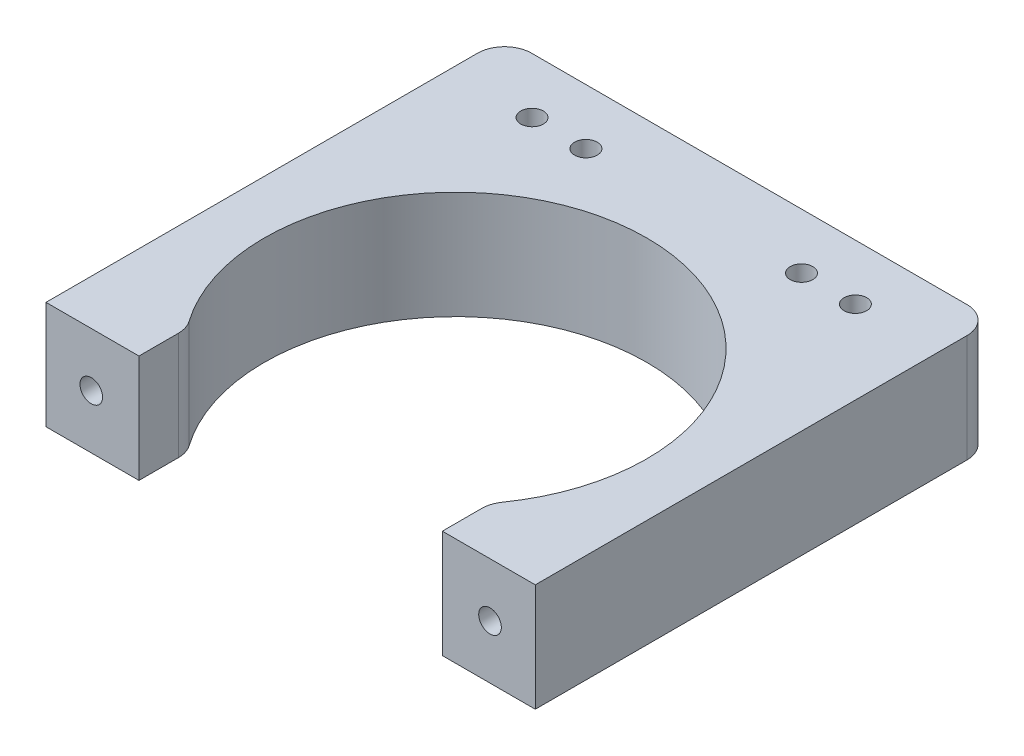
ISO-10303-21;
HEADER;
FILE_DESCRIPTION(('STEP AP214'),'2;1');
FILE_NAME('part.step','',(''),(''),'','','');
FILE_SCHEMA(('AUTOMOTIVE_DESIGN { 1 0 10303 214 1 1 1 1 }'));
ENDSEC;
DATA;
#1=APPLICATION_CONTEXT('core data for automotive mechanical design processes');
#2=APPLICATION_PROTOCOL_DEFINITION('international standard','automotive_design',2000,#1);
#3=PRODUCT_CONTEXT('',#1,'mechanical');
#4=PRODUCT('Part','Part','',(#3));
#5=PRODUCT_RELATED_PRODUCT_CATEGORY('part','',(#4));
#6=PRODUCT_DEFINITION_FORMATION('','',#4);
#7=PRODUCT_DEFINITION_CONTEXT('part definition',#1,'design');
#8=PRODUCT_DEFINITION('design','',#6,#7);
#9=PRODUCT_DEFINITION_SHAPE('','',#8);
#10=(LENGTH_UNIT() NAMED_UNIT(*) SI_UNIT(.MILLI.,.METRE.));
#11=(NAMED_UNIT(*) PLANE_ANGLE_UNIT() SI_UNIT($,.RADIAN.));
#12=(NAMED_UNIT(*) SI_UNIT($,.STERADIAN.) SOLID_ANGLE_UNIT());
#13=UNCERTAINTY_MEASURE_WITH_UNIT(LENGTH_MEASURE(1.E-05),#10,'distance_accuracy_value','');
#14=(GEOMETRIC_REPRESENTATION_CONTEXT(3) GLOBAL_UNCERTAINTY_ASSIGNED_CONTEXT((#13)) GLOBAL_UNIT_ASSIGNED_CONTEXT((#10,
#11,#12)) REPRESENTATION_CONTEXT('',''));
#15=CARTESIAN_POINT('',(0.,0.,0.));
#16=DIRECTION('',(0.,0.,1.));
#17=DIRECTION('',(1.,0.,0.));
#18=AXIS2_PLACEMENT_3D('',#15,#16,#17);
#19=CARTESIAN_POINT('',(45.4,20.,-42.55));
#20=DIRECTION('',(-1.,0.,0.));
#21=DIRECTION('',(0.,0.,1.));
#22=AXIS2_PLACEMENT_3D('',#19,#20,#21);
#23=PLANE('',#22);
#24=DIRECTION('',(0.,0.,-1.));
#25=VECTOR('',#24,1.);
#26=CARTESIAN_POINT('',(45.4,0.,-42.55));
#27=LINE('',#26,#25);
#28=CARTESIAN_POINT('',(45.4,0.,42.55));
#29=VERTEX_POINT('',#28);
#30=CARTESIAN_POINT('',(45.4,0.,-37.55));
#31=VERTEX_POINT('',#30);
#32=EDGE_CURVE('E216',#29,#31,#27,.T.);
#33=ORIENTED_EDGE('',*,*,#32,.T.);
#34=DIRECTION('',(0.,-1.,0.));
#35=VECTOR('',#34,1.);
#36=CARTESIAN_POINT('',(45.4,20.,-37.55));
#37=LINE('',#36,#35);
#38=CARTESIAN_POINT('',(45.4,20.,-37.55));
#39=VERTEX_POINT('',#38);
#40=EDGE_CURVE('E49',#31,#39,#37,.F.);
#41=ORIENTED_EDGE('',*,*,#40,.T.);
#42=DIRECTION('',(0.,0.,-1.));
#43=VECTOR('',#42,1.);
#44=CARTESIAN_POINT('',(45.4,20.,-42.55));
#45=LINE('',#44,#43);
#46=CARTESIAN_POINT('',(45.4,20.,42.55));
#47=VERTEX_POINT('',#46);
#48=EDGE_CURVE('E237',#47,#39,#45,.T.);
#49=ORIENTED_EDGE('',*,*,#48,.F.);
#50=DIRECTION('',(0.,-1.,0.));
#51=VECTOR('',#50,1.);
#52=CARTESIAN_POINT('',(45.4,20.,42.55));
#53=LINE('',#52,#51);
#54=EDGE_CURVE('E256',#47,#29,#53,.T.);
#55=ORIENTED_EDGE('',*,*,#54,.T.);
#56=EDGE_LOOP('',(#33,#41,#49,#55));
#57=FACE_BOUND('',#56,.T.);
#58=ADVANCED_FACE('F41',(#57),#23,.F.);
#59=CARTESIAN_POINT('',(-45.4,20.,-42.55));
#60=DIRECTION('',(0.,0.,1.));
#61=DIRECTION('',(1.,0.,0.));
#62=AXIS2_PLACEMENT_3D('',#59,#60,#61);
#63=PLANE('',#62);
#64=CARTESIAN_POINT('',(30.,10.,-42.55));
#65=DIRECTION('',(0.,0.,-1.));
#66=DIRECTION('',(-1.,0.,0.));
#67=AXIS2_PLACEMENT_3D('',#64,#65,#66);
#68=CIRCLE('',#67,2.09999999999999);
#69=CARTESIAN_POINT('',(27.9,10.,-42.55));
#70=VERTEX_POINT('',#69);
#71=EDGE_CURVE('E188',#70,#70,#68,.T.);
#72=ORIENTED_EDGE('',*,*,#71,.F.);
#73=EDGE_LOOP('',(#72));
#74=FACE_BOUND('',#73,.T.);
#75=CARTESIAN_POINT('',(10.,10.,-42.55));
#76=DIRECTION('',(0.,0.,-1.));
#77=DIRECTION('',(-1.,0.,0.));
#78=AXIS2_PLACEMENT_3D('',#75,#76,#77);
#79=CIRCLE('',#78,2.09999999999999);
#80=CARTESIAN_POINT('',(7.90000000000001,10.,-42.55));
#81=VERTEX_POINT('',#80);
#82=EDGE_CURVE('E194',#81,#81,#79,.T.);
#83=ORIENTED_EDGE('',*,*,#82,.F.);
#84=EDGE_LOOP('',(#83));
#85=FACE_BOUND('',#84,.T.);
#86=CARTESIAN_POINT('',(-10.,10.,-42.55));
#87=DIRECTION('',(0.,0.,-1.));
#88=DIRECTION('',(-1.,0.,0.));
#89=AXIS2_PLACEMENT_3D('',#86,#87,#88);
#90=CIRCLE('',#89,2.09999999999999);
#91=CARTESIAN_POINT('',(-12.1,10.,-42.55));
#92=VERTEX_POINT('',#91);
#93=EDGE_CURVE('E200',#92,#92,#90,.T.);
#94=ORIENTED_EDGE('',*,*,#93,.F.);
#95=EDGE_LOOP('',(#94));
#96=FACE_BOUND('',#95,.T.);
#97=CARTESIAN_POINT('',(-30.,10.,-42.55));
#98=DIRECTION('',(0.,0.,-1.));
#99=DIRECTION('',(-1.,0.,0.));
#100=AXIS2_PLACEMENT_3D('',#97,#98,#99);
#101=CIRCLE('',#100,2.09999999999999);
#102=CARTESIAN_POINT('',(-32.1,10.,-42.55));
#103=VERTEX_POINT('',#102);
#104=EDGE_CURVE('E206',#103,#103,#101,.T.);
#105=ORIENTED_EDGE('',*,*,#104,.F.);
#106=EDGE_LOOP('',(#105));
#107=FACE_BOUND('',#106,.T.);
#108=DIRECTION('',(-1.,0.,0.));
#109=VECTOR('',#108,1.);
#110=CARTESIAN_POINT('',(-45.4,20.,-42.55));
#111=LINE('',#110,#109);
#112=CARTESIAN_POINT('',(40.4,20.,-42.55));
#113=VERTEX_POINT('',#112);
#114=CARTESIAN_POINT('',(-40.4,20.,-42.55));
#115=VERTEX_POINT('',#114);
#116=EDGE_CURVE('E240',#113,#115,#111,.T.);
#117=ORIENTED_EDGE('',*,*,#116,.F.);
#118=DIRECTION('',(0.,-1.,0.));
#119=VECTOR('',#118,1.);
#120=CARTESIAN_POINT('',(40.4,20.,-42.55));
#121=LINE('',#120,#119);
#122=CARTESIAN_POINT('',(40.4,0.,-42.55));
#123=VERTEX_POINT('',#122);
#124=EDGE_CURVE('E311',#113,#123,#121,.T.);
#125=ORIENTED_EDGE('',*,*,#124,.T.);
#126=DIRECTION('',(-1.,0.,0.));
#127=VECTOR('',#126,1.);
#128=CARTESIAN_POINT('',(-45.4,0.,-42.55));
#129=LINE('',#128,#127);
#130=CARTESIAN_POINT('',(-40.4,0.,-42.55));
#131=VERTEX_POINT('',#130);
#132=EDGE_CURVE('E259',#123,#131,#129,.T.);
#133=ORIENTED_EDGE('',*,*,#132,.T.);
#134=DIRECTION('',(0.,-1.,0.));
#135=VECTOR('',#134,1.);
#136=CARTESIAN_POINT('',(-40.4,20.,-42.55));
#137=LINE('',#136,#135);
#138=EDGE_CURVE('E309',#131,#115,#137,.F.);
#139=ORIENTED_EDGE('',*,*,#138,.T.);
#140=EDGE_LOOP('',(#117,#125,#133,#139));
#141=FACE_BOUND('',#140,.T.);
#142=ADVANCED_FACE('F327',(#74,#85,#96,#107,#141),#63,.F.);
#143=CARTESIAN_POINT('',(-45.4,20.,-42.55));
#144=DIRECTION('',(1.,0.,0.));
#145=DIRECTION('',(0.,0.,-1.));
#146=AXIS2_PLACEMENT_3D('',#143,#144,#145);
#147=PLANE('',#146);
#148=CARTESIAN_POINT('',(-45.4,10.,-17.45));
#149=DIRECTION('',(-1.,0.,0.));
#150=DIRECTION('',(0.,0.,1.));
#151=AXIS2_PLACEMENT_3D('',#148,#149,#150);
#152=CIRCLE('',#151,2.09999999999999);
#153=CARTESIAN_POINT('',(-45.4,10.,-15.35));
#154=VERTEX_POINT('',#153);
#155=EDGE_CURVE('E176',#154,#154,#152,.T.);
#156=ORIENTED_EDGE('',*,*,#155,.F.);
#157=EDGE_LOOP('',(#156));
#158=FACE_BOUND('',#157,.T.);
#159=CARTESIAN_POINT('',(-45.4,10.,22.55));
#160=DIRECTION('',(-1.,0.,0.));
#161=DIRECTION('',(0.,0.,1.));
#162=AXIS2_PLACEMENT_3D('',#159,#160,#161);
#163=CIRCLE('',#162,2.09999999999999);
#164=CARTESIAN_POINT('',(-45.4,10.,24.65));
#165=VERTEX_POINT('',#164);
#166=EDGE_CURVE('E182',#165,#165,#163,.T.);
#167=ORIENTED_EDGE('',*,*,#166,.F.);
#168=EDGE_LOOP('',(#167));
#169=FACE_BOUND('',#168,.T.);
#170=DIRECTION('',(0.,0.,1.));
#171=VECTOR('',#170,1.);
#172=CARTESIAN_POINT('',(-45.4,20.,-42.55));
#173=LINE('',#172,#171);
#174=CARTESIAN_POINT('',(-45.4,20.,-37.55));
#175=VERTEX_POINT('',#174);
#176=CARTESIAN_POINT('',(-45.4,20.,42.55));
#177=VERTEX_POINT('',#176);
#178=EDGE_CURVE('E243',#175,#177,#173,.T.);
#179=ORIENTED_EDGE('',*,*,#178,.F.);
#180=DIRECTION('',(0.,-1.,0.));
#181=VECTOR('',#180,1.);
#182=CARTESIAN_POINT('',(-45.4,20.,-37.55));
#183=LINE('',#182,#181);
#184=CARTESIAN_POINT('',(-45.4,0.,-37.55));
#185=VERTEX_POINT('',#184);
#186=EDGE_CURVE('E12',#175,#185,#183,.T.);
#187=ORIENTED_EDGE('',*,*,#186,.T.);
#188=DIRECTION('',(0.,0.,1.));
#189=VECTOR('',#188,1.);
#190=CARTESIAN_POINT('',(-45.4,0.,-42.55));
#191=LINE('',#190,#189);
#192=CARTESIAN_POINT('',(-45.4,0.,42.55));
#193=VERTEX_POINT('',#192);
#194=EDGE_CURVE('E262',#185,#193,#191,.T.);
#195=ORIENTED_EDGE('',*,*,#194,.T.);
#196=DIRECTION('',(0.,-1.,0.));
#197=VECTOR('',#196,1.);
#198=CARTESIAN_POINT('',(-45.4,20.,42.55));
#199=LINE('',#198,#197);
#200=EDGE_CURVE('E282',#177,#193,#199,.T.);
#201=ORIENTED_EDGE('',*,*,#200,.F.);
#202=EDGE_LOOP('',(#179,#187,#195,#201));
#203=FACE_BOUND('',#202,.T.);
#204=ADVANCED_FACE('F337',(#158,#169,#203),#147,.F.);
#205=CARTESIAN_POINT('',(-45.4,20.,42.55));
#206=DIRECTION('',(0.,0.,-1.));
#207=DIRECTION('',(-1.,0.,0.));
#208=AXIS2_PLACEMENT_3D('',#205,#206,#207);
#209=PLANE('',#208);
#210=CARTESIAN_POINT('',(-37.,10.,42.55));
#211=DIRECTION('',(0.,0.,1.));
#212=DIRECTION('',(1.,0.,0.));
#213=AXIS2_PLACEMENT_3D('',#210,#211,#212);
#214=CIRCLE('',#213,2.09999999999999);
#215=CARTESIAN_POINT('',(-34.9,10.,42.55));
#216=VERTEX_POINT('',#215);
#217=EDGE_CURVE('E165',#216,#216,#214,.T.);
#218=ORIENTED_EDGE('',*,*,#217,.F.);
#219=EDGE_LOOP('',(#218));
#220=FACE_BOUND('',#219,.T.);
#221=DIRECTION('',(1.,0.,0.));
#222=VECTOR('',#221,1.);
#223=CARTESIAN_POINT('',(-45.4,0.,42.55));
#224=LINE('',#223,#222);
#225=CARTESIAN_POINT('',(-28.15,0.,42.55));
#226=VERTEX_POINT('',#225);
#227=EDGE_CURVE('E264',#193,#226,#224,.T.);
#228=ORIENTED_EDGE('',*,*,#227,.T.);
#229=DIRECTION('',(0.,-1.,0.));
#230=VECTOR('',#229,1.);
#231=CARTESIAN_POINT('',(-28.15,20.,42.55));
#232=LINE('',#231,#230);
#233=CARTESIAN_POINT('',(-28.15,20.,42.55));
#234=VERTEX_POINT('',#233);
#235=EDGE_CURVE('E279',#234,#226,#232,.T.);
#236=ORIENTED_EDGE('',*,*,#235,.F.);
#237=DIRECTION('',(1.,0.,0.));
#238=VECTOR('',#237,1.);
#239=CARTESIAN_POINT('',(-45.4,20.,42.55));
#240=LINE('',#239,#238);
#241=EDGE_CURVE('E245',#177,#234,#240,.T.);
#242=ORIENTED_EDGE('',*,*,#241,.F.);
#243=ORIENTED_EDGE('',*,*,#200,.T.);
#244=EDGE_LOOP('',(#228,#236,#242,#243));
#245=FACE_BOUND('',#244,.T.);
#246=ADVANCED_FACE('F343',(#220,#245),#209,.F.);
#247=CARTESIAN_POINT('',(-28.15,20.,42.55));
#248=DIRECTION('',(-1.,0.,0.));
#249=DIRECTION('',(0.,0.,1.));
#250=AXIS2_PLACEMENT_3D('',#247,#248,#249);
#251=PLANE('',#250);
#252=DIRECTION('',(0.,0.,-1.));
#253=VECTOR('',#252,1.);
#254=CARTESIAN_POINT('',(-28.15,0.,42.55));
#255=LINE('',#254,#253);
#256=CARTESIAN_POINT('',(-28.15,0.,35.2164457964684));
#257=VERTEX_POINT('',#256);
#258=EDGE_CURVE('E266',#226,#257,#255,.T.);
#259=ORIENTED_EDGE('',*,*,#258,.T.);
#260=DIRECTION('',(0.,-1.,0.));
#261=VECTOR('',#260,1.);
#262=CARTESIAN_POINT('',(-28.15,20.,35.2164457964684));
#263=LINE('',#262,#261);
#264=CARTESIAN_POINT('',(-28.15,20.,35.2164457964684));
#265=VERTEX_POINT('',#264);
#266=EDGE_CURVE('E56',#257,#265,#263,.F.);
#267=ORIENTED_EDGE('',*,*,#266,.T.);
#268=DIRECTION('',(0.,0.,-1.));
#269=VECTOR('',#268,1.);
#270=CARTESIAN_POINT('',(-28.15,20.,42.55));
#271=LINE('',#270,#269);
#272=EDGE_CURVE('E247',#234,#265,#271,.T.);
#273=ORIENTED_EDGE('',*,*,#272,.F.);
#274=ORIENTED_EDGE('',*,*,#235,.T.);
#275=EDGE_LOOP('',(#259,#267,#273,#274));
#276=FACE_BOUND('',#275,.T.);
#277=ADVANCED_FACE('F345',(#276),#251,.F.);
#278=CARTESIAN_POINT('',(0.,20.,11.95));
#279=DIRECTION('',(0.,-1.,0.));
#280=DIRECTION('',(0.,0.,-1.));
#281=AXIS2_PLACEMENT_3D('',#278,#279,#280);
#282=CYLINDRICAL_SURFACE('',#281,35.5);
#283=CARTESIAN_POINT('',(0.,0.,11.95));
#284=DIRECTION('',(0.,-1.,0.));
#285=DIRECTION('',(0.,0.,1.));
#286=AXIS2_PLACEMENT_3D('',#283,#284,#285);
#287=CIRCLE('',#286,35.5);
#288=CARTESIAN_POINT('',(-29.0574074074074,0.,32.344045080855));
#289=VERTEX_POINT('',#288);
#290=CARTESIAN_POINT('',(29.0574074074074,0.,32.344045080855));
#291=VERTEX_POINT('',#290);
#292=EDGE_CURVE('E268',#289,#291,#287,.T.);
#293=ORIENTED_EDGE('',*,*,#292,.T.);
#294=DIRECTION('',(0.,-1.,0.));
#295=VECTOR('',#294,1.);
#296=CARTESIAN_POINT('',(29.0574074074074,20.,32.344045080855));
#297=LINE('',#296,#295);
#298=CARTESIAN_POINT('',(29.0574074074074,20.,32.344045080855));
#299=VERTEX_POINT('',#298);
#300=EDGE_CURVE('E299',#291,#299,#297,.F.);
#301=ORIENTED_EDGE('',*,*,#300,.T.);
#302=CARTESIAN_POINT('',(0.,20.,11.95));
#303=DIRECTION('',(0.,-1.,0.));
#304=DIRECTION('',(0.,0.,1.));
#305=AXIS2_PLACEMENT_3D('',#302,#303,#304);
#306=CIRCLE('',#305,35.5);
#307=CARTESIAN_POINT('',(-29.0574074074074,20.,32.344045080855));
#308=VERTEX_POINT('',#307);
#309=EDGE_CURVE('E249',#308,#299,#306,.T.);
#310=ORIENTED_EDGE('',*,*,#309,.F.);
#311=DIRECTION('',(0.,-1.,0.));
#312=VECTOR('',#311,1.);
#313=CARTESIAN_POINT('',(-29.0574074074074,20.,32.344045080855));
#314=LINE('',#313,#312);
#315=EDGE_CURVE('E296',#308,#289,#314,.T.);
#316=ORIENTED_EDGE('',*,*,#315,.T.);
#317=EDGE_LOOP('',(#293,#301,#310,#316));
#318=FACE_BOUND('',#317,.T.);
#319=ADVANCED_FACE('F347',(#318),#282,.F.);
#320=CARTESIAN_POINT('',(28.15,20.,42.55));
#321=DIRECTION('',(1.,0.,0.));
#322=DIRECTION('',(0.,0.,-1.));
#323=AXIS2_PLACEMENT_3D('',#320,#321,#322);
#324=PLANE('',#323);
#325=DIRECTION('',(0.,0.,1.));
#326=VECTOR('',#325,1.);
#327=CARTESIAN_POINT('',(28.15,20.,42.55));
#328=LINE('',#327,#326);
#329=CARTESIAN_POINT('',(28.15,20.,35.2164457964684));
#330=VERTEX_POINT('',#329);
#331=CARTESIAN_POINT('',(28.15,20.,42.55));
#332=VERTEX_POINT('',#331);
#333=EDGE_CURVE('E252',#330,#332,#328,.T.);
#334=ORIENTED_EDGE('',*,*,#333,.F.);
#335=DIRECTION('',(0.,-1.,0.));
#336=VECTOR('',#335,1.);
#337=CARTESIAN_POINT('',(28.15,20.,35.2164457964684));
#338=LINE('',#337,#336);
#339=CARTESIAN_POINT('',(28.15,0.,35.2164457964684));
#340=VERTEX_POINT('',#339);
#341=EDGE_CURVE('E285',#330,#340,#338,.T.);
#342=ORIENTED_EDGE('',*,*,#341,.T.);
#343=DIRECTION('',(0.,0.,1.));
#344=VECTOR('',#343,1.);
#345=CARTESIAN_POINT('',(28.15,0.,42.55));
#346=LINE('',#345,#344);
#347=CARTESIAN_POINT('',(28.15,0.,42.55));
#348=VERTEX_POINT('',#347);
#349=EDGE_CURVE('E271',#340,#348,#346,.T.);
#350=ORIENTED_EDGE('',*,*,#349,.T.);
#351=DIRECTION('',(0.,-1.,0.));
#352=VECTOR('',#351,1.);
#353=CARTESIAN_POINT('',(28.15,20.,42.55));
#354=LINE('',#353,#352);
#355=EDGE_CURVE('E276',#332,#348,#354,.T.);
#356=ORIENTED_EDGE('',*,*,#355,.F.);
#357=EDGE_LOOP('',(#334,#342,#350,#356));
#358=FACE_BOUND('',#357,.T.);
#359=ADVANCED_FACE('F353',(#358),#324,.F.);
#360=CARTESIAN_POINT('',(28.15,20.,42.55));
#361=DIRECTION('',(0.,0.,-1.));
#362=DIRECTION('',(-1.,0.,0.));
#363=AXIS2_PLACEMENT_3D('',#360,#361,#362);
#364=PLANE('',#363);
#365=CARTESIAN_POINT('',(37.,10.,42.55));
#366=DIRECTION('',(0.,0.,1.));
#367=DIRECTION('',(1.,0.,0.));
#368=AXIS2_PLACEMENT_3D('',#365,#366,#367);
#369=CIRCLE('',#368,2.09999999999999);
#370=CARTESIAN_POINT('',(39.1,10.,42.55));
#371=VERTEX_POINT('',#370);
#372=EDGE_CURVE('E166',#371,#371,#369,.T.);
#373=ORIENTED_EDGE('',*,*,#372,.F.);
#374=EDGE_LOOP('',(#373));
#375=FACE_BOUND('',#374,.T.);
#376=DIRECTION('',(1.,0.,0.));
#377=VECTOR('',#376,1.);
#378=CARTESIAN_POINT('',(28.15,0.,42.55));
#379=LINE('',#378,#377);
#380=EDGE_CURVE('E241',#348,#29,#379,.T.);
#381=ORIENTED_EDGE('',*,*,#380,.T.);
#382=ORIENTED_EDGE('',*,*,#54,.F.);
#383=DIRECTION('',(1.,0.,0.));
#384=VECTOR('',#383,1.);
#385=CARTESIAN_POINT('',(28.15,20.,42.55));
#386=LINE('',#385,#384);
#387=EDGE_CURVE('E254',#332,#47,#386,.T.);
#388=ORIENTED_EDGE('',*,*,#387,.F.);
#389=ORIENTED_EDGE('',*,*,#355,.T.);
#390=EDGE_LOOP('',(#381,#382,#388,#389));
#391=FACE_BOUND('',#390,.T.);
#392=ADVANCED_FACE('F610',(#375,#391),#364,.F.);
#393=CARTESIAN_POINT('',(0.,20.,11.95));
#394=DIRECTION('',(0.,1.,0.));
#395=DIRECTION('',(0.,0.,1.));
#396=AXIS2_PLACEMENT_3D('',#393,#394,#395);
#397=PLANE('',#396);
#398=CARTESIAN_POINT('',(-30.,20.,-32.25));
#399=DIRECTION('',(0.,1.,0.));
#400=DIRECTION('',(0.,0.,1.));
#401=AXIS2_PLACEMENT_3D('',#398,#399,#400);
#402=CIRCLE('',#401,2.1);
#403=CARTESIAN_POINT('',(-30.,20.,-30.15));
#404=VERTEX_POINT('',#403);
#405=EDGE_CURVE('E217',#404,#404,#402,.T.);
#406=ORIENTED_EDGE('',*,*,#405,.F.);
#407=EDGE_LOOP('',(#406));
#408=FACE_BOUND('',#407,.T.);
#409=CARTESIAN_POINT('',(-20.,20.,-32.25));
#410=DIRECTION('',(0.,1.,0.));
#411=DIRECTION('',(0.,0.,1.));
#412=AXIS2_PLACEMENT_3D('',#409,#410,#411);
#413=CIRCLE('',#412,2.1);
#414=CARTESIAN_POINT('',(-20.,20.,-30.15));
#415=VERTEX_POINT('',#414);
#416=EDGE_CURVE('E220',#415,#415,#413,.T.);
#417=ORIENTED_EDGE('',*,*,#416,.F.);
#418=EDGE_LOOP('',(#417));
#419=FACE_BOUND('',#418,.T.);
#420=CARTESIAN_POINT('',(20.,20.,-32.25));
#421=DIRECTION('',(0.,1.,0.));
#422=DIRECTION('',(0.,0.,-1.));
#423=AXIS2_PLACEMENT_3D('',#420,#421,#422);
#424=CIRCLE('',#423,2.1);
#425=CARTESIAN_POINT('',(20.,20.,-34.35));
#426=VERTEX_POINT('',#425);
#427=EDGE_CURVE('E226',#426,#426,#424,.T.);
#428=ORIENTED_EDGE('',*,*,#427,.F.);
#429=EDGE_LOOP('',(#428));
#430=FACE_BOUND('',#429,.T.);
#431=CARTESIAN_POINT('',(30.,20.,-32.25));
#432=DIRECTION('',(0.,1.,0.));
#433=DIRECTION('',(0.,0.,-1.));
#434=AXIS2_PLACEMENT_3D('',#431,#432,#433);
#435=CIRCLE('',#434,2.1);
#436=CARTESIAN_POINT('',(30.,20.,-34.35));
#437=VERTEX_POINT('',#436);
#438=EDGE_CURVE('E232',#437,#437,#435,.T.);
#439=ORIENTED_EDGE('',*,*,#438,.F.);
#440=EDGE_LOOP('',(#439));
#441=FACE_BOUND('',#440,.T.);
#442=ORIENTED_EDGE('',*,*,#309,.T.);
#443=CARTESIAN_POINT('',(33.15,20.,35.2164457964684));
#444=DIRECTION('',(0.,1.,0.));
#445=DIRECTION('',(0.,0.,1.));
#446=AXIS2_PLACEMENT_3D('',#443,#444,#445);
#447=CIRCLE('',#446,5.);
#448=EDGE_CURVE('E306',#299,#330,#447,.T.);
#449=ORIENTED_EDGE('',*,*,#448,.T.);
#450=ORIENTED_EDGE('',*,*,#333,.T.);
#451=ORIENTED_EDGE('',*,*,#387,.T.);
#452=ORIENTED_EDGE('',*,*,#48,.T.);
#453=CARTESIAN_POINT('',(40.4,20.,-37.55));
#454=DIRECTION('',(0.,1.,0.));
#455=DIRECTION('',(0.,0.,1.));
#456=AXIS2_PLACEMENT_3D('',#453,#454,#455);
#457=CIRCLE('',#456,5.);
#458=EDGE_CURVE('E302',#39,#113,#457,.T.);
#459=ORIENTED_EDGE('',*,*,#458,.T.);
#460=ORIENTED_EDGE('',*,*,#116,.T.);
#461=CARTESIAN_POINT('',(-40.4,20.,-37.55));
#462=DIRECTION('',(0.,1.,0.));
#463=DIRECTION('',(0.,0.,1.));
#464=AXIS2_PLACEMENT_3D('',#461,#462,#463);
#465=CIRCLE('',#464,5.);
#466=EDGE_CURVE('E64',#115,#175,#465,.T.);
#467=ORIENTED_EDGE('',*,*,#466,.T.);
#468=ORIENTED_EDGE('',*,*,#178,.T.);
#469=ORIENTED_EDGE('',*,*,#241,.T.);
#470=ORIENTED_EDGE('',*,*,#272,.T.);
#471=CARTESIAN_POINT('',(-33.15,20.,35.2164457964684));
#472=DIRECTION('',(0.,1.,0.));
#473=DIRECTION('',(0.,0.,1.));
#474=AXIS2_PLACEMENT_3D('',#471,#472,#473);
#475=CIRCLE('',#474,5.);
#476=EDGE_CURVE('E304',#265,#308,#475,.T.);
#477=ORIENTED_EDGE('',*,*,#476,.T.);
#478=EDGE_LOOP('',(#442,#449,#450,#451,#452,#459,#460,#467,#468,#469,#470,#477));
#479=FACE_BOUND('',#478,.T.);
#480=ADVANCED_FACE('F319',(#408,#419,#430,#441,#479),#397,.T.);
#481=CARTESIAN_POINT('',(0.,0.,11.95));
#482=DIRECTION('',(0.,1.,0.));
#483=DIRECTION('',(0.,0.,1.));
#484=AXIS2_PLACEMENT_3D('',#481,#482,#483);
#485=PLANE('',#484);
#486=CARTESIAN_POINT('',(-30.,0.,-32.25));
#487=DIRECTION('',(0.,1.,0.));
#488=DIRECTION('',(0.,0.,1.));
#489=AXIS2_PLACEMENT_3D('',#486,#487,#488);
#490=CIRCLE('',#489,2.1);
#491=CARTESIAN_POINT('',(-30.,0.,-30.15));
#492=VERTEX_POINT('',#491);
#493=EDGE_CURVE('E213',#492,#492,#490,.T.);
#494=ORIENTED_EDGE('',*,*,#493,.T.);
#495=EDGE_LOOP('',(#494));
#496=FACE_BOUND('',#495,.T.);
#497=CARTESIAN_POINT('',(-20.,0.,-32.25));
#498=DIRECTION('',(0.,1.,0.));
#499=DIRECTION('',(0.,0.,1.));
#500=AXIS2_PLACEMENT_3D('',#497,#498,#499);
#501=CIRCLE('',#500,2.1);
#502=CARTESIAN_POINT('',(-20.,0.,-30.15));
#503=VERTEX_POINT('',#502);
#504=EDGE_CURVE('E223',#503,#503,#501,.T.);
#505=ORIENTED_EDGE('',*,*,#504,.T.);
#506=EDGE_LOOP('',(#505));
#507=FACE_BOUND('',#506,.T.);
#508=CARTESIAN_POINT('',(20.,0.,-32.25));
#509=DIRECTION('',(0.,1.,0.));
#510=DIRECTION('',(0.,0.,-1.));
#511=AXIS2_PLACEMENT_3D('',#508,#509,#510);
#512=CIRCLE('',#511,2.1);
#513=CARTESIAN_POINT('',(20.,0.,-34.35));
#514=VERTEX_POINT('',#513);
#515=EDGE_CURVE('E229',#514,#514,#512,.T.);
#516=ORIENTED_EDGE('',*,*,#515,.T.);
#517=EDGE_LOOP('',(#516));
#518=FACE_BOUND('',#517,.T.);
#519=CARTESIAN_POINT('',(30.,0.,-32.25));
#520=DIRECTION('',(0.,1.,0.));
#521=DIRECTION('',(0.,0.,-1.));
#522=AXIS2_PLACEMENT_3D('',#519,#520,#521);
#523=CIRCLE('',#522,2.1);
#524=CARTESIAN_POINT('',(30.,0.,-34.35));
#525=VERTEX_POINT('',#524);
#526=EDGE_CURVE('E212',#525,#525,#523,.T.);
#527=ORIENTED_EDGE('',*,*,#526,.T.);
#528=EDGE_LOOP('',(#527));
#529=FACE_BOUND('',#528,.T.);
#530=ORIENTED_EDGE('',*,*,#349,.F.);
#531=CARTESIAN_POINT('',(33.15,0.,35.2164457964684));
#532=DIRECTION('',(0.,1.,0.));
#533=DIRECTION('',(0.,0.,1.));
#534=AXIS2_PLACEMENT_3D('',#531,#532,#533);
#535=CIRCLE('',#534,5.);
#536=EDGE_CURVE('E294',#340,#291,#535,.F.);
#537=ORIENTED_EDGE('',*,*,#536,.T.);
#538=ORIENTED_EDGE('',*,*,#292,.F.);
#539=CARTESIAN_POINT('',(-33.15,0.,35.2164457964684));
#540=DIRECTION('',(0.,1.,0.));
#541=DIRECTION('',(0.,0.,1.));
#542=AXIS2_PLACEMENT_3D('',#539,#540,#541);
#543=CIRCLE('',#542,5.);
#544=EDGE_CURVE('E292',#289,#257,#543,.F.);
#545=ORIENTED_EDGE('',*,*,#544,.T.);
#546=ORIENTED_EDGE('',*,*,#258,.F.);
#547=ORIENTED_EDGE('',*,*,#227,.F.);
#548=ORIENTED_EDGE('',*,*,#194,.F.);
#549=CARTESIAN_POINT('',(-40.4,0.,-37.55));
#550=DIRECTION('',(0.,1.,0.));
#551=DIRECTION('',(0.,0.,1.));
#552=AXIS2_PLACEMENT_3D('',#549,#550,#551);
#553=CIRCLE('',#552,5.);
#554=EDGE_CURVE('E288',#185,#131,#553,.F.);
#555=ORIENTED_EDGE('',*,*,#554,.T.);
#556=ORIENTED_EDGE('',*,*,#132,.F.);
#557=CARTESIAN_POINT('',(40.4,0.,-37.55));
#558=DIRECTION('',(0.,1.,0.));
#559=DIRECTION('',(0.,0.,1.));
#560=AXIS2_PLACEMENT_3D('',#557,#558,#559);
#561=CIRCLE('',#560,5.);
#562=EDGE_CURVE('E290',#123,#31,#561,.F.);
#563=ORIENTED_EDGE('',*,*,#562,.T.);
#564=ORIENTED_EDGE('',*,*,#32,.F.);
#565=ORIENTED_EDGE('',*,*,#380,.F.);
#566=EDGE_LOOP('',(#530,#537,#538,#545,#546,#547,#548,#555,#556,#563,#564,#565));
#567=FACE_BOUND('',#566,.T.);
#568=ADVANCED_FACE('F331',(#496,#507,#518,#529,#567),#485,.F.);
#569=CARTESIAN_POINT('',(30.,0.,-32.25));
#570=DIRECTION('',(0.,1.,0.));
#571=DIRECTION('',(0.,0.,1.));
#572=AXIS2_PLACEMENT_3D('',#569,#570,#571);
#573=CYLINDRICAL_SURFACE('',#572,2.1);
#574=ORIENTED_EDGE('',*,*,#526,.F.);
#575=EDGE_LOOP('',(#574));
#576=FACE_BOUND('',#575,.T.);
#577=ORIENTED_EDGE('',*,*,#438,.T.);
#578=EDGE_LOOP('',(#577));
#579=FACE_BOUND('',#578,.T.);
#580=ADVANCED_FACE('F583',(#576,#579),#573,.F.);
#581=CARTESIAN_POINT('',(20.,0.,-32.25));
#582=DIRECTION('',(0.,1.,0.));
#583=DIRECTION('',(0.,0.,1.));
#584=AXIS2_PLACEMENT_3D('',#581,#582,#583);
#585=CYLINDRICAL_SURFACE('',#584,2.1);
#586=ORIENTED_EDGE('',*,*,#515,.F.);
#587=EDGE_LOOP('',(#586));
#588=FACE_BOUND('',#587,.T.);
#589=ORIENTED_EDGE('',*,*,#427,.T.);
#590=EDGE_LOOP('',(#589));
#591=FACE_BOUND('',#590,.T.);
#592=ADVANCED_FACE('F573',(#588,#591),#585,.F.);
#593=CARTESIAN_POINT('',(-20.,0.,-32.25));
#594=DIRECTION('',(0.,1.,0.));
#595=DIRECTION('',(0.,0.,1.));
#596=AXIS2_PLACEMENT_3D('',#593,#594,#595);
#597=CYLINDRICAL_SURFACE('',#596,2.1);
#598=ORIENTED_EDGE('',*,*,#504,.F.);
#599=EDGE_LOOP('',(#598));
#600=FACE_BOUND('',#599,.T.);
#601=ORIENTED_EDGE('',*,*,#416,.T.);
#602=EDGE_LOOP('',(#601));
#603=FACE_BOUND('',#602,.T.);
#604=ADVANCED_FACE('F563',(#600,#603),#597,.F.);
#605=CARTESIAN_POINT('',(-30.,0.,-32.25));
#606=DIRECTION('',(0.,1.,0.));
#607=DIRECTION('',(0.,0.,1.));
#608=AXIS2_PLACEMENT_3D('',#605,#606,#607);
#609=CYLINDRICAL_SURFACE('',#608,2.1);
#610=ORIENTED_EDGE('',*,*,#493,.F.);
#611=EDGE_LOOP('',(#610));
#612=FACE_BOUND('',#611,.T.);
#613=ORIENTED_EDGE('',*,*,#405,.T.);
#614=EDGE_LOOP('',(#613));
#615=FACE_BOUND('',#614,.T.);
#616=ADVANCED_FACE('F553',(#612,#615),#609,.F.);
#617=CARTESIAN_POINT('',(-30.,10.,-36.55));
#618=DIRECTION('',(0.,0.,-1.));
#619=DIRECTION('',(-1.,0.,0.));
#620=AXIS2_PLACEMENT_3D('',#617,#618,#619);
#621=CONICAL_SURFACE('',#620,2.1,1.02974425867665);
#622=CARTESIAN_POINT('',(-30.,10.,-35.2881927000421));
#623=VERTEX_POINT('',#622);
#624=VERTEX_LOOP('',#623);
#625=FACE_BOUND('',#624,.T.);
#626=CARTESIAN_POINT('',(-30.,10.,-36.55));
#627=DIRECTION('',(0.,0.,-1.));
#628=DIRECTION('',(-1.,0.,0.));
#629=AXIS2_PLACEMENT_3D('',#626,#627,#628);
#630=CIRCLE('',#629,2.1);
#631=CARTESIAN_POINT('',(-32.1,10.,-36.55));
#632=VERTEX_POINT('',#631);
#633=EDGE_CURVE('E209',#632,#632,#630,.T.);
#634=ORIENTED_EDGE('',*,*,#633,.T.);
#635=EDGE_LOOP('',(#634));
#636=FACE_BOUND('',#635,.T.);
#637=ADVANCED_FACE('F543',(#625,#636),#621,.F.);
#638=CARTESIAN_POINT('',(-30.,10.,-42.55));
#639=DIRECTION('',(0.,0.,-1.));
#640=DIRECTION('',(-1.,0.,0.));
#641=AXIS2_PLACEMENT_3D('',#638,#639,#640);
#642=CYLINDRICAL_SURFACE('',#641,2.09999999999999);
#643=ORIENTED_EDGE('',*,*,#633,.F.);
#644=EDGE_LOOP('',(#643));
#645=FACE_BOUND('',#644,.T.);
#646=ORIENTED_EDGE('',*,*,#104,.T.);
#647=EDGE_LOOP('',(#646));
#648=FACE_BOUND('',#647,.T.);
#649=ADVANCED_FACE('F533',(#645,#648),#642,.F.);
#650=CARTESIAN_POINT('',(-10.,10.,-36.55));
#651=DIRECTION('',(0.,0.,-1.));
#652=DIRECTION('',(-1.,0.,0.));
#653=AXIS2_PLACEMENT_3D('',#650,#651,#652);
#654=CONICAL_SURFACE('',#653,2.1,1.02974425867665);
#655=CARTESIAN_POINT('',(-10.,10.,-35.2881927000421));
#656=VERTEX_POINT('',#655);
#657=VERTEX_LOOP('',#656);
#658=FACE_BOUND('',#657,.T.);
#659=CARTESIAN_POINT('',(-10.,10.,-36.55));
#660=DIRECTION('',(0.,0.,-1.));
#661=DIRECTION('',(-1.,0.,0.));
#662=AXIS2_PLACEMENT_3D('',#659,#660,#661);
#663=CIRCLE('',#662,2.1);
#664=CARTESIAN_POINT('',(-12.1,10.,-36.55));
#665=VERTEX_POINT('',#664);
#666=EDGE_CURVE('E203',#665,#665,#663,.T.);
#667=ORIENTED_EDGE('',*,*,#666,.T.);
#668=EDGE_LOOP('',(#667));
#669=FACE_BOUND('',#668,.T.);
#670=ADVANCED_FACE('F523',(#658,#669),#654,.F.);
#671=CARTESIAN_POINT('',(-10.,10.,-42.55));
#672=DIRECTION('',(0.,0.,-1.));
#673=DIRECTION('',(-1.,0.,0.));
#674=AXIS2_PLACEMENT_3D('',#671,#672,#673);
#675=CYLINDRICAL_SURFACE('',#674,2.09999999999999);
#676=ORIENTED_EDGE('',*,*,#666,.F.);
#677=EDGE_LOOP('',(#676));
#678=FACE_BOUND('',#677,.T.);
#679=ORIENTED_EDGE('',*,*,#93,.T.);
#680=EDGE_LOOP('',(#679));
#681=FACE_BOUND('',#680,.T.);
#682=ADVANCED_FACE('F513',(#678,#681),#675,.F.);
#683=CARTESIAN_POINT('',(10.,10.,-36.55));
#684=DIRECTION('',(0.,0.,-1.));
#685=DIRECTION('',(-1.,0.,0.));
#686=AXIS2_PLACEMENT_3D('',#683,#684,#685);
#687=CONICAL_SURFACE('',#686,2.1,1.02974425867665);
#688=CARTESIAN_POINT('',(10.,10.,-35.2881927000421));
#689=VERTEX_POINT('',#688);
#690=VERTEX_LOOP('',#689);
#691=FACE_BOUND('',#690,.T.);
#692=CARTESIAN_POINT('',(10.,10.,-36.55));
#693=DIRECTION('',(0.,0.,-1.));
#694=DIRECTION('',(-1.,0.,0.));
#695=AXIS2_PLACEMENT_3D('',#692,#693,#694);
#696=CIRCLE('',#695,2.1);
#697=CARTESIAN_POINT('',(7.90000000000001,10.,-36.55));
#698=VERTEX_POINT('',#697);
#699=EDGE_CURVE('E197',#698,#698,#696,.T.);
#700=ORIENTED_EDGE('',*,*,#699,.T.);
#701=EDGE_LOOP('',(#700));
#702=FACE_BOUND('',#701,.T.);
#703=ADVANCED_FACE('F503',(#691,#702),#687,.F.);
#704=CARTESIAN_POINT('',(10.,10.,-42.55));
#705=DIRECTION('',(0.,0.,-1.));
#706=DIRECTION('',(-1.,0.,0.));
#707=AXIS2_PLACEMENT_3D('',#704,#705,#706);
#708=CYLINDRICAL_SURFACE('',#707,2.09999999999999);
#709=ORIENTED_EDGE('',*,*,#699,.F.);
#710=EDGE_LOOP('',(#709));
#711=FACE_BOUND('',#710,.T.);
#712=ORIENTED_EDGE('',*,*,#82,.T.);
#713=EDGE_LOOP('',(#712));
#714=FACE_BOUND('',#713,.T.);
#715=ADVANCED_FACE('F493',(#711,#714),#708,.F.);
#716=CARTESIAN_POINT('',(30.,10.,-36.55));
#717=DIRECTION('',(0.,0.,-1.));
#718=DIRECTION('',(-1.,0.,0.));
#719=AXIS2_PLACEMENT_3D('',#716,#717,#718);
#720=CONICAL_SURFACE('',#719,2.09999999999999,1.02974425867665);
#721=CARTESIAN_POINT('',(30.,10.,-35.2881927000421));
#722=VERTEX_POINT('',#721);
#723=VERTEX_LOOP('',#722);
#724=FACE_BOUND('',#723,.T.);
#725=CARTESIAN_POINT('',(30.,10.,-36.55));
#726=DIRECTION('',(0.,0.,-1.));
#727=DIRECTION('',(-1.,0.,0.));
#728=AXIS2_PLACEMENT_3D('',#725,#726,#727);
#729=CIRCLE('',#728,2.09999999999999);
#730=CARTESIAN_POINT('',(27.9,10.,-36.55));
#731=VERTEX_POINT('',#730);
#732=EDGE_CURVE('E191',#731,#731,#729,.T.);
#733=ORIENTED_EDGE('',*,*,#732,.T.);
#734=EDGE_LOOP('',(#733));
#735=FACE_BOUND('',#734,.T.);
#736=ADVANCED_FACE('F483',(#724,#735),#720,.F.);
#737=CARTESIAN_POINT('',(30.,10.,-42.55));
#738=DIRECTION('',(0.,0.,-1.));
#739=DIRECTION('',(-1.,0.,0.));
#740=AXIS2_PLACEMENT_3D('',#737,#738,#739);
#741=CYLINDRICAL_SURFACE('',#740,2.09999999999999);
#742=ORIENTED_EDGE('',*,*,#732,.F.);
#743=EDGE_LOOP('',(#742));
#744=FACE_BOUND('',#743,.T.);
#745=ORIENTED_EDGE('',*,*,#71,.T.);
#746=EDGE_LOOP('',(#745));
#747=FACE_BOUND('',#746,.T.);
#748=ADVANCED_FACE('F473',(#744,#747),#741,.F.);
#749=CARTESIAN_POINT('',(-39.4,10.,22.55));
#750=DIRECTION('',(-1.,0.,0.));
#751=DIRECTION('',(0.,0.,1.));
#752=AXIS2_PLACEMENT_3D('',#749,#750,#751);
#753=CONICAL_SURFACE('',#752,2.09999999999999,1.02974425867665);
#754=CARTESIAN_POINT('',(-38.1381927000421,10.,22.55));
#755=VERTEX_POINT('',#754);
#756=VERTEX_LOOP('',#755);
#757=FACE_BOUND('',#756,.T.);
#758=CARTESIAN_POINT('',(-39.4,10.,22.55));
#759=DIRECTION('',(-1.,0.,0.));
#760=DIRECTION('',(0.,0.,1.));
#761=AXIS2_PLACEMENT_3D('',#758,#759,#760);
#762=CIRCLE('',#761,2.09999999999999);
#763=CARTESIAN_POINT('',(-39.4,10.,24.65));
#764=VERTEX_POINT('',#763);
#765=EDGE_CURVE('E185',#764,#764,#762,.T.);
#766=ORIENTED_EDGE('',*,*,#765,.T.);
#767=EDGE_LOOP('',(#766));
#768=FACE_BOUND('',#767,.T.);
#769=ADVANCED_FACE('F463',(#757,#768),#753,.F.);
#770=CARTESIAN_POINT('',(-45.4,10.,22.55));
#771=DIRECTION('',(-1.,0.,0.));
#772=DIRECTION('',(0.,0.,1.));
#773=AXIS2_PLACEMENT_3D('',#770,#771,#772);
#774=CYLINDRICAL_SURFACE('',#773,2.09999999999999);
#775=ORIENTED_EDGE('',*,*,#765,.F.);
#776=EDGE_LOOP('',(#775));
#777=FACE_BOUND('',#776,.T.);
#778=ORIENTED_EDGE('',*,*,#166,.T.);
#779=EDGE_LOOP('',(#778));
#780=FACE_BOUND('',#779,.T.);
#781=ADVANCED_FACE('F453',(#777,#780),#774,.F.);
#782=CARTESIAN_POINT('',(-39.4,10.,-17.45));
#783=DIRECTION('',(-1.,0.,0.));
#784=DIRECTION('',(0.,0.,1.));
#785=AXIS2_PLACEMENT_3D('',#782,#783,#784);
#786=CONICAL_SURFACE('',#785,2.09999999999999,1.02974425867665);
#787=CARTESIAN_POINT('',(-38.1381927000421,10.,-17.45));
#788=VERTEX_POINT('',#787);
#789=VERTEX_LOOP('',#788);
#790=FACE_BOUND('',#789,.T.);
#791=CARTESIAN_POINT('',(-39.4,10.,-17.45));
#792=DIRECTION('',(-1.,0.,0.));
#793=DIRECTION('',(0.,0.,1.));
#794=AXIS2_PLACEMENT_3D('',#791,#792,#793);
#795=CIRCLE('',#794,2.09999999999999);
#796=CARTESIAN_POINT('',(-39.4,10.,-15.35));
#797=VERTEX_POINT('',#796);
#798=EDGE_CURVE('E179',#797,#797,#795,.T.);
#799=ORIENTED_EDGE('',*,*,#798,.T.);
#800=EDGE_LOOP('',(#799));
#801=FACE_BOUND('',#800,.T.);
#802=ADVANCED_FACE('F443',(#790,#801),#786,.F.);
#803=CARTESIAN_POINT('',(-45.4,10.,-17.45));
#804=DIRECTION('',(-1.,0.,0.));
#805=DIRECTION('',(0.,0.,1.));
#806=AXIS2_PLACEMENT_3D('',#803,#804,#805);
#807=CYLINDRICAL_SURFACE('',#806,2.09999999999999);
#808=ORIENTED_EDGE('',*,*,#798,.F.);
#809=EDGE_LOOP('',(#808));
#810=FACE_BOUND('',#809,.T.);
#811=ORIENTED_EDGE('',*,*,#155,.T.);
#812=EDGE_LOOP('',(#811));
#813=FACE_BOUND('',#812,.T.);
#814=ADVANCED_FACE('F433',(#810,#813),#807,.F.);
#815=CARTESIAN_POINT('',(-37.,10.,36.55));
#816=DIRECTION('',(0.,0.,1.));
#817=DIRECTION('',(1.,0.,0.));
#818=AXIS2_PLACEMENT_3D('',#815,#816,#817);
#819=CONICAL_SURFACE('',#818,2.09999999999999,1.02974425867666);
#820=CARTESIAN_POINT('',(-37.,10.,35.2881927000421));
#821=VERTEX_POINT('',#820);
#822=VERTEX_LOOP('',#821);
#823=FACE_BOUND('',#822,.T.);
#824=CARTESIAN_POINT('',(-37.,10.,36.55));
#825=DIRECTION('',(0.,0.,1.));
#826=DIRECTION('',(1.,0.,0.));
#827=AXIS2_PLACEMENT_3D('',#824,#825,#826);
#828=CIRCLE('',#827,2.09999999999999);
#829=CARTESIAN_POINT('',(-34.9,10.,36.55));
#830=VERTEX_POINT('',#829);
#831=EDGE_CURVE('E169',#830,#830,#828,.T.);
#832=ORIENTED_EDGE('',*,*,#831,.T.);
#833=EDGE_LOOP('',(#832));
#834=FACE_BOUND('',#833,.T.);
#835=ADVANCED_FACE('F423',(#823,#834),#819,.F.);
#836=CARTESIAN_POINT('',(-37.,10.,42.55));
#837=DIRECTION('',(0.,0.,1.));
#838=DIRECTION('',(1.,0.,0.));
#839=AXIS2_PLACEMENT_3D('',#836,#837,#838);
#840=CYLINDRICAL_SURFACE('',#839,2.09999999999999);
#841=ORIENTED_EDGE('',*,*,#831,.F.);
#842=EDGE_LOOP('',(#841));
#843=FACE_BOUND('',#842,.T.);
#844=ORIENTED_EDGE('',*,*,#217,.T.);
#845=EDGE_LOOP('',(#844));
#846=FACE_BOUND('',#845,.T.);
#847=ADVANCED_FACE('F159',(#843,#846),#840,.F.);
#848=CARTESIAN_POINT('',(37.,10.,36.55));
#849=DIRECTION('',(0.,0.,1.));
#850=DIRECTION('',(1.,0.,0.));
#851=AXIS2_PLACEMENT_3D('',#848,#849,#850);
#852=CONICAL_SURFACE('',#851,2.09999999999999,1.02974425867666);
#853=CARTESIAN_POINT('',(37.,10.,35.2881927000421));
#854=VERTEX_POINT('',#853);
#855=VERTEX_LOOP('',#854);
#856=FACE_BOUND('',#855,.T.);
#857=CARTESIAN_POINT('',(37.,10.,36.55));
#858=DIRECTION('',(0.,0.,1.));
#859=DIRECTION('',(1.,0.,0.));
#860=AXIS2_PLACEMENT_3D('',#857,#858,#859);
#861=CIRCLE('',#860,2.09999999999999);
#862=CARTESIAN_POINT('',(39.1,10.,36.55));
#863=VERTEX_POINT('',#862);
#864=EDGE_CURVE('E163',#863,#863,#861,.T.);
#865=ORIENTED_EDGE('',*,*,#864,.T.);
#866=EDGE_LOOP('',(#865));
#867=FACE_BOUND('',#866,.T.);
#868=ADVANCED_FACE('F155',(#856,#867),#852,.F.);
#869=CARTESIAN_POINT('',(37.,10.,42.55));
#870=DIRECTION('',(0.,0.,1.));
#871=DIRECTION('',(1.,0.,0.));
#872=AXIS2_PLACEMENT_3D('',#869,#870,#871);
#873=CYLINDRICAL_SURFACE('',#872,2.09999999999999);
#874=ORIENTED_EDGE('',*,*,#864,.F.);
#875=EDGE_LOOP('',(#874));
#876=FACE_BOUND('',#875,.T.);
#877=ORIENTED_EDGE('',*,*,#372,.T.);
#878=EDGE_LOOP('',(#877));
#879=FACE_BOUND('',#878,.T.);
#880=ADVANCED_FACE('F158',(#876,#879),#873,.F.);
#881=CARTESIAN_POINT('',(33.15,20.,35.2164457964684));
#882=DIRECTION('',(0.,-1.,0.));
#883=DIRECTION('',(0.,0.,-1.));
#884=AXIS2_PLACEMENT_3D('',#881,#882,#883);
#885=CYLINDRICAL_SURFACE('',#884,5.);
#886=ORIENTED_EDGE('',*,*,#448,.F.);
#887=ORIENTED_EDGE('',*,*,#300,.F.);
#888=ORIENTED_EDGE('',*,*,#536,.F.);
#889=ORIENTED_EDGE('',*,*,#341,.F.);
#890=EDGE_LOOP('',(#886,#887,#888,#889));
#891=FACE_BOUND('',#890,.T.);
#892=ADVANCED_FACE('F369',(#891),#885,.T.);
#893=CARTESIAN_POINT('',(-33.15,20.,35.2164457964684));
#894=DIRECTION('',(0.,-1.,0.));
#895=DIRECTION('',(0.,0.,-1.));
#896=AXIS2_PLACEMENT_3D('',#893,#894,#895);
#897=CYLINDRICAL_SURFACE('',#896,5.);
#898=ORIENTED_EDGE('',*,*,#476,.F.);
#899=ORIENTED_EDGE('',*,*,#266,.F.);
#900=ORIENTED_EDGE('',*,*,#544,.F.);
#901=ORIENTED_EDGE('',*,*,#315,.F.);
#902=EDGE_LOOP('',(#898,#899,#900,#901));
#903=FACE_BOUND('',#902,.T.);
#904=ADVANCED_FACE('F372',(#903),#897,.T.);
#905=CARTESIAN_POINT('',(40.4,20.,-37.55));
#906=DIRECTION('',(0.,-1.,0.));
#907=DIRECTION('',(0.,0.,-1.));
#908=AXIS2_PLACEMENT_3D('',#905,#906,#907);
#909=CYLINDRICAL_SURFACE('',#908,5.);
#910=ORIENTED_EDGE('',*,*,#458,.F.);
#911=ORIENTED_EDGE('',*,*,#40,.F.);
#912=ORIENTED_EDGE('',*,*,#562,.F.);
#913=ORIENTED_EDGE('',*,*,#124,.F.);
#914=EDGE_LOOP('',(#910,#911,#912,#913));
#915=FACE_BOUND('',#914,.T.);
#916=ADVANCED_FACE('F324',(#915),#909,.T.);
#917=CARTESIAN_POINT('',(-40.4,20.,-37.55));
#918=DIRECTION('',(0.,-1.,0.));
#919=DIRECTION('',(0.,0.,-1.));
#920=AXIS2_PLACEMENT_3D('',#917,#918,#919);
#921=CYLINDRICAL_SURFACE('',#920,5.);
#922=ORIENTED_EDGE('',*,*,#466,.F.);
#923=ORIENTED_EDGE('',*,*,#138,.F.);
#924=ORIENTED_EDGE('',*,*,#554,.F.);
#925=ORIENTED_EDGE('',*,*,#186,.F.);
#926=EDGE_LOOP('',(#922,#923,#924,#925));
#927=FACE_BOUND('',#926,.T.);
#928=ADVANCED_FACE('F43',(#927),#921,.T.);
#929=CLOSED_SHELL('',(#58,#142,#204,#246,#277,#319,#359,#392,#480,#568,#580,#592,#604,#616,#637,
#649,#670,#682,#703,#715,#736,#748,#769,#781,#802,#814,#835,#847,#868,#880,#892,#904,#916,#928));
#930=MANIFOLD_SOLID_BREP('B2',#929);
#931=ADVANCED_BREP_SHAPE_REPRESENTATION('',(#18,#930),#14);
#932=SHAPE_DEFINITION_REPRESENTATION(#9,#931);
ENDSEC;
END-ISO-10303-21;
